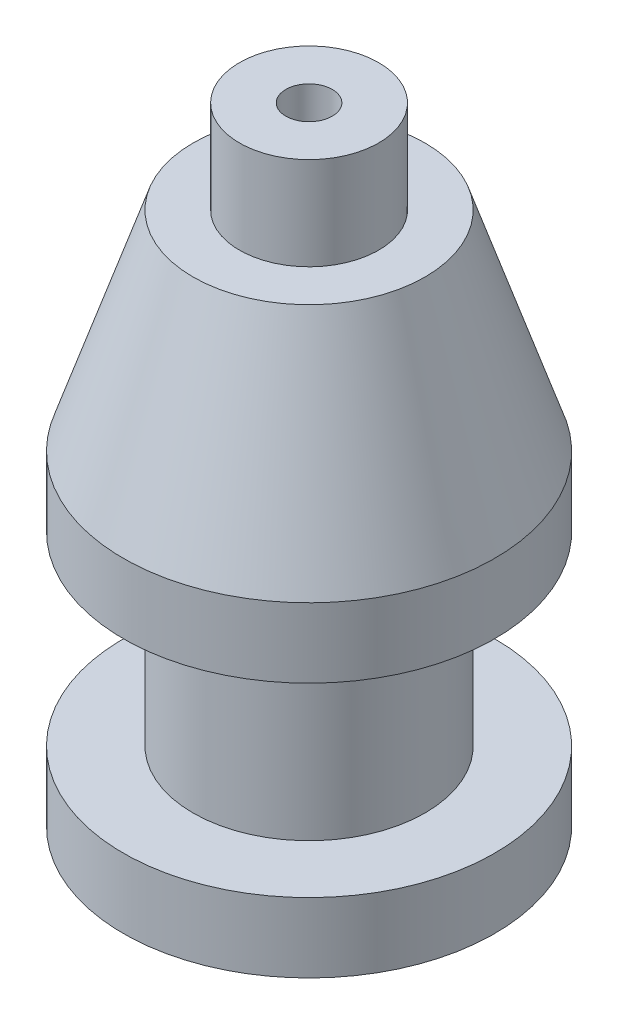
ISO-10303-21;
HEADER;
FILE_DESCRIPTION(('STEP AP214'),'2;1');
FILE_NAME('part.step','',(''),(''),'','','');
FILE_SCHEMA(('AUTOMOTIVE_DESIGN { 1 0 10303 214 1 1 1 1 }'));
ENDSEC;
DATA;
#1=APPLICATION_CONTEXT('core data for automotive mechanical design processes');
#2=APPLICATION_PROTOCOL_DEFINITION('international standard','automotive_design',2000,#1);
#3=PRODUCT_CONTEXT('',#1,'mechanical');
#4=PRODUCT('Part','Part','',(#3));
#5=PRODUCT_RELATED_PRODUCT_CATEGORY('part','',(#4));
#6=PRODUCT_DEFINITION_FORMATION('','',#4);
#7=PRODUCT_DEFINITION_CONTEXT('part definition',#1,'design');
#8=PRODUCT_DEFINITION('design','',#6,#7);
#9=PRODUCT_DEFINITION_SHAPE('','',#8);
#10=(LENGTH_UNIT() NAMED_UNIT(*) SI_UNIT(.MILLI.,.METRE.));
#11=(NAMED_UNIT(*) PLANE_ANGLE_UNIT() SI_UNIT($,.RADIAN.));
#12=(NAMED_UNIT(*) SI_UNIT($,.STERADIAN.) SOLID_ANGLE_UNIT());
#13=UNCERTAINTY_MEASURE_WITH_UNIT(LENGTH_MEASURE(1.E-05),#10,'distance_accuracy_value','');
#14=(GEOMETRIC_REPRESENTATION_CONTEXT(3) GLOBAL_UNCERTAINTY_ASSIGNED_CONTEXT((#13)) GLOBAL_UNIT_ASSIGNED_CONTEXT((#10,
#11,#12)) REPRESENTATION_CONTEXT('',''));
#15=CARTESIAN_POINT('',(0.,0.,0.));
#16=DIRECTION('',(0.,0.,1.));
#17=DIRECTION('',(1.,0.,0.));
#18=AXIS2_PLACEMENT_3D('',#15,#16,#17);
#19=CARTESIAN_POINT('',(80.,0.,0.));
#20=DIRECTION('',(0.,-1.,0.));
#21=DIRECTION('',(0.,0.,-1.));
#22=AXIS2_PLACEMENT_3D('',#19,#20,#21);
#23=PLANE('',#22);
#24=CARTESIAN_POINT('',(0.,0.,0.));
#25=DIRECTION('',(0.,-1.,0.));
#26=DIRECTION('',(0.,0.,-1.));
#27=AXIS2_PLACEMENT_3D('',#24,#25,#26);
#28=CIRCLE('',#27,80.);
#29=CARTESIAN_POINT('',(0.,0.,-80.));
#30=VERTEX_POINT('',#29);
#31=EDGE_CURVE('E88',#30,#30,#28,.T.);
#32=ORIENTED_EDGE('',*,*,#31,.T.);
#33=EDGE_LOOP('',(#32));
#34=FACE_BOUND('',#33,.T.);
#35=CARTESIAN_POINT('',(0.,0.,0.));
#36=DIRECTION('',(0.,-1.,0.));
#37=DIRECTION('',(0.,0.,-1.));
#38=AXIS2_PLACEMENT_3D('',#35,#36,#37);
#39=CIRCLE('',#38,10.);
#40=CARTESIAN_POINT('',(0.,0.,-10.));
#41=VERTEX_POINT('',#40);
#42=EDGE_CURVE('E10',#41,#41,#39,.T.);
#43=ORIENTED_EDGE('',*,*,#42,.F.);
#44=EDGE_LOOP('',(#43));
#45=FACE_BOUND('',#44,.T.);
#46=ADVANCED_FACE('F41',(#34,#45),#23,.T.);
#47=CARTESIAN_POINT('',(0.,0.,0.));
#48=DIRECTION('',(0.,-1.,0.));
#49=DIRECTION('',(0.,0.,-1.));
#50=AXIS2_PLACEMENT_3D('',#47,#48,#49);
#51=CYLINDRICAL_SURFACE('',#50,10.);
#52=ORIENTED_EDGE('',*,*,#42,.T.);
#53=EDGE_LOOP('',(#52));
#54=FACE_BOUND('',#53,.T.);
#55=CARTESIAN_POINT('',(0.,270.,0.));
#56=DIRECTION('',(0.,-1.,0.));
#57=DIRECTION('',(0.,0.,-1.));
#58=AXIS2_PLACEMENT_3D('',#55,#56,#57);
#59=CIRCLE('',#58,10.);
#60=CARTESIAN_POINT('',(0.,270.,-10.));
#61=VERTEX_POINT('',#60);
#62=EDGE_CURVE('E48',#61,#61,#59,.T.);
#63=ORIENTED_EDGE('',*,*,#62,.F.);
#64=EDGE_LOOP('',(#63));
#65=FACE_BOUND('',#64,.T.);
#66=ADVANCED_FACE('F107',(#54,#65),#51,.F.);
#67=CARTESIAN_POINT('',(10.,270.,0.));
#68=DIRECTION('',(0.,1.,0.));
#69=DIRECTION('',(0.,0.,1.));
#70=AXIS2_PLACEMENT_3D('',#67,#68,#69);
#71=PLANE('',#70);
#72=ORIENTED_EDGE('',*,*,#62,.T.);
#73=EDGE_LOOP('',(#72));
#74=FACE_BOUND('',#73,.T.);
#75=CARTESIAN_POINT('',(0.,270.,0.));
#76=DIRECTION('',(0.,-1.,0.));
#77=DIRECTION('',(0.,0.,-1.));
#78=AXIS2_PLACEMENT_3D('',#75,#76,#77);
#79=CIRCLE('',#78,30.);
#80=CARTESIAN_POINT('',(0.,270.,-30.));
#81=VERTEX_POINT('',#80);
#82=EDGE_CURVE('E53',#81,#81,#79,.T.);
#83=ORIENTED_EDGE('',*,*,#82,.F.);
#84=EDGE_LOOP('',(#83));
#85=FACE_BOUND('',#84,.T.);
#86=ADVANCED_FACE('F111',(#74,#85),#71,.T.);
#87=CARTESIAN_POINT('',(0.,0.,0.));
#88=DIRECTION('',(0.,-1.,0.));
#89=DIRECTION('',(0.,0.,-1.));
#90=AXIS2_PLACEMENT_3D('',#87,#88,#89);
#91=CYLINDRICAL_SURFACE('',#90,30.);
#92=ORIENTED_EDGE('',*,*,#82,.T.);
#93=EDGE_LOOP('',(#92));
#94=FACE_BOUND('',#93,.T.);
#95=CARTESIAN_POINT('',(0.,230.,0.));
#96=DIRECTION('',(0.,-1.,0.));
#97=DIRECTION('',(0.,0.,-1.));
#98=AXIS2_PLACEMENT_3D('',#95,#96,#97);
#99=CIRCLE('',#98,30.);
#100=CARTESIAN_POINT('',(0.,230.,-30.));
#101=VERTEX_POINT('',#100);
#102=EDGE_CURVE('E58',#101,#101,#99,.T.);
#103=ORIENTED_EDGE('',*,*,#102,.F.);
#104=EDGE_LOOP('',(#103));
#105=FACE_BOUND('',#104,.T.);
#106=ADVANCED_FACE('F115',(#94,#105),#91,.T.);
#107=CARTESIAN_POINT('',(30.,230.,0.));
#108=DIRECTION('',(0.,1.,0.));
#109=DIRECTION('',(0.,0.,1.));
#110=AXIS2_PLACEMENT_3D('',#107,#108,#109);
#111=PLANE('',#110);
#112=ORIENTED_EDGE('',*,*,#102,.T.);
#113=EDGE_LOOP('',(#112));
#114=FACE_BOUND('',#113,.T.);
#115=CARTESIAN_POINT('',(0.,230.,0.));
#116=DIRECTION('',(0.,-1.,0.));
#117=DIRECTION('',(0.,0.,-1.));
#118=AXIS2_PLACEMENT_3D('',#115,#116,#117);
#119=CIRCLE('',#118,50.);
#120=CARTESIAN_POINT('',(0.,230.,-50.));
#121=VERTEX_POINT('',#120);
#122=EDGE_CURVE('E64',#121,#121,#119,.T.);
#123=ORIENTED_EDGE('',*,*,#122,.F.);
#124=EDGE_LOOP('',(#123));
#125=FACE_BOUND('',#124,.T.);
#126=ADVANCED_FACE('F121',(#114,#125),#111,.T.);
#127=CARTESIAN_POINT('',(0.,140.,0.));
#128=DIRECTION('',(0.,-1.,0.));
#129=DIRECTION('',(0.,0.,-1.));
#130=AXIS2_PLACEMENT_3D('',#127,#128,#129);
#131=CONICAL_SURFACE('',#130,80.,0.321750554396642);
#132=ORIENTED_EDGE('',*,*,#122,.T.);
#133=EDGE_LOOP('',(#132));
#134=FACE_BOUND('',#133,.T.);
#135=CARTESIAN_POINT('',(0.,140.,0.));
#136=DIRECTION('',(0.,-1.,0.));
#137=DIRECTION('',(0.,0.,-1.));
#138=AXIS2_PLACEMENT_3D('',#135,#136,#137);
#139=CIRCLE('',#138,80.);
#140=CARTESIAN_POINT('',(0.,140.,-80.));
#141=VERTEX_POINT('',#140);
#142=EDGE_CURVE('E68',#141,#141,#139,.T.);
#143=ORIENTED_EDGE('',*,*,#142,.F.);
#144=EDGE_LOOP('',(#143));
#145=FACE_BOUND('',#144,.T.);
#146=ADVANCED_FACE('F125',(#134,#145),#131,.T.);
#147=CARTESIAN_POINT('',(0.,0.,0.));
#148=DIRECTION('',(0.,-1.,0.));
#149=DIRECTION('',(0.,0.,-1.));
#150=AXIS2_PLACEMENT_3D('',#147,#148,#149);
#151=CYLINDRICAL_SURFACE('',#150,80.);
#152=ORIENTED_EDGE('',*,*,#142,.T.);
#153=EDGE_LOOP('',(#152));
#154=FACE_BOUND('',#153,.T.);
#155=CARTESIAN_POINT('',(0.,110.,0.));
#156=DIRECTION('',(0.,-1.,0.));
#157=DIRECTION('',(0.,0.,-1.));
#158=AXIS2_PLACEMENT_3D('',#155,#156,#157);
#159=CIRCLE('',#158,80.);
#160=CARTESIAN_POINT('',(0.,110.,-80.));
#161=VERTEX_POINT('',#160);
#162=EDGE_CURVE('E72',#161,#161,#159,.T.);
#163=ORIENTED_EDGE('',*,*,#162,.F.);
#164=EDGE_LOOP('',(#163));
#165=FACE_BOUND('',#164,.T.);
#166=ADVANCED_FACE('F129',(#154,#165),#151,.T.);
#167=CARTESIAN_POINT('',(80.,110.,0.));
#168=DIRECTION('',(0.,-1.,0.));
#169=DIRECTION('',(0.,0.,-1.));
#170=AXIS2_PLACEMENT_3D('',#167,#168,#169);
#171=PLANE('',#170);
#172=ORIENTED_EDGE('',*,*,#162,.T.);
#173=EDGE_LOOP('',(#172));
#174=FACE_BOUND('',#173,.T.);
#175=CARTESIAN_POINT('',(0.,110.,0.));
#176=DIRECTION('',(0.,-1.,0.));
#177=DIRECTION('',(0.,0.,-1.));
#178=AXIS2_PLACEMENT_3D('',#175,#176,#177);
#179=CIRCLE('',#178,50.);
#180=CARTESIAN_POINT('',(0.,110.,-50.));
#181=VERTEX_POINT('',#180);
#182=EDGE_CURVE('E76',#181,#181,#179,.T.);
#183=ORIENTED_EDGE('',*,*,#182,.F.);
#184=EDGE_LOOP('',(#183));
#185=FACE_BOUND('',#184,.T.);
#186=ADVANCED_FACE('F133',(#174,#185),#171,.T.);
#187=CARTESIAN_POINT('',(0.,0.,0.));
#188=DIRECTION('',(0.,-1.,0.));
#189=DIRECTION('',(0.,0.,-1.));
#190=AXIS2_PLACEMENT_3D('',#187,#188,#189);
#191=CYLINDRICAL_SURFACE('',#190,50.);
#192=ORIENTED_EDGE('',*,*,#182,.T.);
#193=EDGE_LOOP('',(#192));
#194=FACE_BOUND('',#193,.T.);
#195=CARTESIAN_POINT('',(0.,30.,0.));
#196=DIRECTION('',(0.,-1.,0.));
#197=DIRECTION('',(0.,0.,-1.));
#198=AXIS2_PLACEMENT_3D('',#195,#196,#197);
#199=CIRCLE('',#198,50.);
#200=CARTESIAN_POINT('',(0.,30.,-50.));
#201=VERTEX_POINT('',#200);
#202=EDGE_CURVE('E80',#201,#201,#199,.T.);
#203=ORIENTED_EDGE('',*,*,#202,.F.);
#204=EDGE_LOOP('',(#203));
#205=FACE_BOUND('',#204,.T.);
#206=ADVANCED_FACE('F103',(#194,#205),#191,.T.);
#207=CARTESIAN_POINT('',(50.,30.,0.));
#208=DIRECTION('',(0.,1.,0.));
#209=DIRECTION('',(0.,0.,1.));
#210=AXIS2_PLACEMENT_3D('',#207,#208,#209);
#211=PLANE('',#210);
#212=ORIENTED_EDGE('',*,*,#202,.T.);
#213=EDGE_LOOP('',(#212));
#214=FACE_BOUND('',#213,.T.);
#215=CARTESIAN_POINT('',(0.,30.,0.));
#216=DIRECTION('',(0.,-1.,0.));
#217=DIRECTION('',(0.,0.,-1.));
#218=AXIS2_PLACEMENT_3D('',#215,#216,#217);
#219=CIRCLE('',#218,80.);
#220=CARTESIAN_POINT('',(0.,30.,-80.));
#221=VERTEX_POINT('',#220);
#222=EDGE_CURVE('E84',#221,#221,#219,.T.);
#223=ORIENTED_EDGE('',*,*,#222,.F.);
#224=EDGE_LOOP('',(#223));
#225=FACE_BOUND('',#224,.T.);
#226=ADVANCED_FACE('F97',(#214,#225),#211,.T.);
#227=CARTESIAN_POINT('',(0.,0.,0.));
#228=DIRECTION('',(0.,-1.,0.));
#229=DIRECTION('',(0.,0.,-1.));
#230=AXIS2_PLACEMENT_3D('',#227,#228,#229);
#231=CYLINDRICAL_SURFACE('',#230,80.);
#232=ORIENTED_EDGE('',*,*,#222,.T.);
#233=EDGE_LOOP('',(#232));
#234=FACE_BOUND('',#233,.T.);
#235=ORIENTED_EDGE('',*,*,#31,.F.);
#236=EDGE_LOOP('',(#235));
#237=FACE_BOUND('',#236,.T.);
#238=ADVANCED_FACE('F95',(#234,#237),#231,.T.);
#239=CLOSED_SHELL('',(#46,#66,#86,#106,#126,#146,#166,#186,#206,#226,#238));
#240=MANIFOLD_SOLID_BREP('B2',#239);
#241=ADVANCED_BREP_SHAPE_REPRESENTATION('',(#18,#240),#14);
#242=SHAPE_DEFINITION_REPRESENTATION(#9,#241);
ENDSEC;
END-ISO-10303-21;
